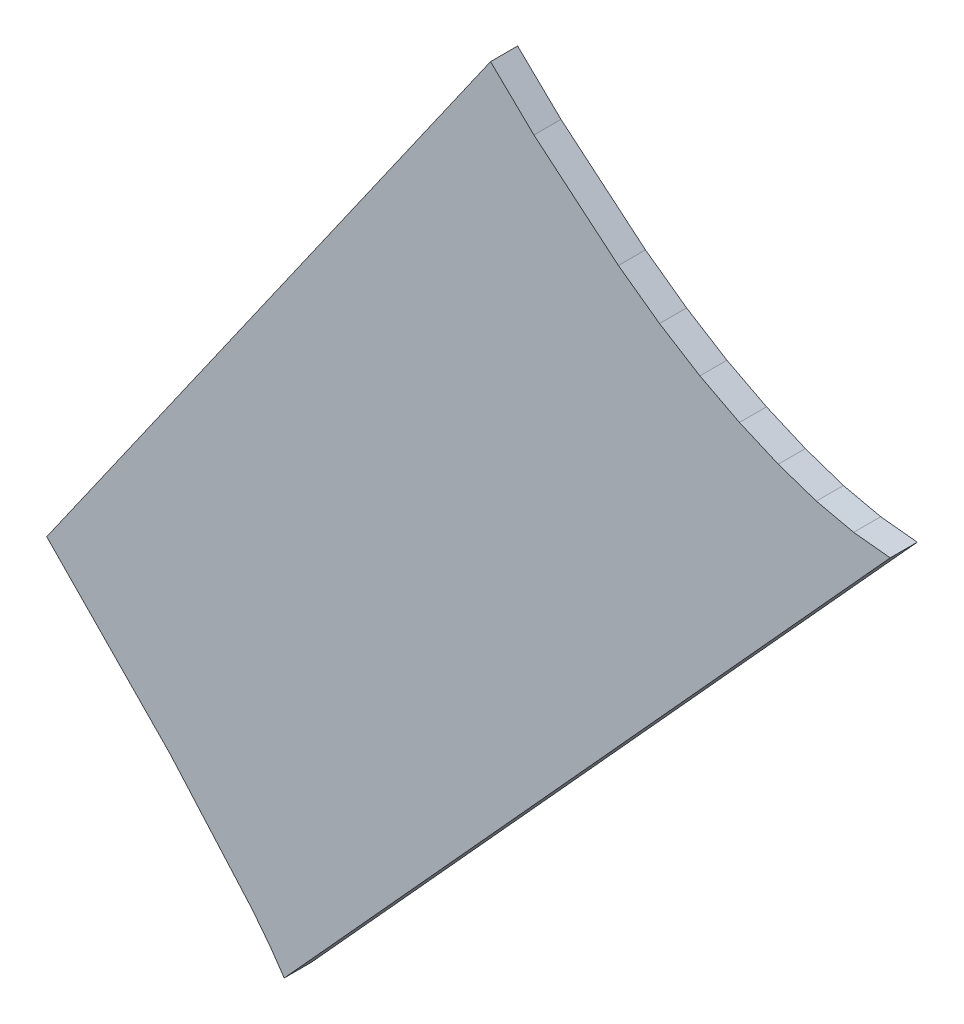
ISO-10303-21;
HEADER;
FILE_DESCRIPTION(('STEP AP214'),'2;1');
FILE_NAME('part.step','',(''),(''),'','','');
FILE_SCHEMA(('AUTOMOTIVE_DESIGN { 1 0 10303 214 1 1 1 1 }'));
ENDSEC;
DATA;
#1=APPLICATION_CONTEXT('core data for automotive mechanical design processes');
#2=APPLICATION_PROTOCOL_DEFINITION('international standard','automotive_design',2000,#1);
#3=PRODUCT_CONTEXT('',#1,'mechanical');
#4=PRODUCT('Part','Part','',(#3));
#5=PRODUCT_RELATED_PRODUCT_CATEGORY('part','',(#4));
#6=PRODUCT_DEFINITION_FORMATION('','',#4);
#7=PRODUCT_DEFINITION_CONTEXT('part definition',#1,'design');
#8=PRODUCT_DEFINITION('design','',#6,#7);
#9=PRODUCT_DEFINITION_SHAPE('','',#8);
#10=(LENGTH_UNIT() NAMED_UNIT(*) SI_UNIT(.MILLI.,.METRE.));
#11=(NAMED_UNIT(*) PLANE_ANGLE_UNIT() SI_UNIT($,.RADIAN.));
#12=(NAMED_UNIT(*) SI_UNIT($,.STERADIAN.) SOLID_ANGLE_UNIT());
#13=UNCERTAINTY_MEASURE_WITH_UNIT(LENGTH_MEASURE(1.E-05),#10,'distance_accuracy_value','');
#14=(GEOMETRIC_REPRESENTATION_CONTEXT(3) GLOBAL_UNCERTAINTY_ASSIGNED_CONTEXT((#13)) GLOBAL_UNIT_ASSIGNED_CONTEXT((#10,
#11,#12)) REPRESENTATION_CONTEXT('',''));
#15=CARTESIAN_POINT('',(0.,0.,0.));
#16=DIRECTION('',(0.,0.,1.));
#17=DIRECTION('',(1.,0.,0.));
#18=AXIS2_PLACEMENT_3D('',#15,#16,#17);
#19=CARTESIAN_POINT('',(67.8379974365234,41.2589988708496,0.));
#20=DIRECTION('',(0.715672064383456,0.698436465443437,0.));
#21=DIRECTION('',(0.698436465443437,-0.715672064383456,0.));
#22=AXIS2_PLACEMENT_3D('',#19,#20,#21);
#23=PLANE('',#22);
#24=DIRECTION('',(0.698436465443437,-0.715672064383456,0.));
#25=VECTOR('',#24,1.);
#26=CARTESIAN_POINT('',(67.8379974365234,41.2589988708496,0.03556));
#27=LINE('',#26,#25);
#28=CARTESIAN_POINT('',(67.8379974365234,41.2589988708496,0.03556));
#29=VERTEX_POINT('',#28);
#30=CARTESIAN_POINT('',(68.,41.0929985046387,0.03556));
#31=VERTEX_POINT('',#30);
#32=EDGE_CURVE('E11',#29,#31,#27,.T.);
#33=ORIENTED_EDGE('',*,*,#32,.F.);
#34=DIRECTION('',(0.,0.,1.));
#35=VECTOR('',#34,1.);
#36=CARTESIAN_POINT('',(67.8379974365234,41.2589988708496,0.));
#37=LINE('',#36,#35);
#38=CARTESIAN_POINT('',(67.8379974365234,41.2589988708496,0.));
#39=VERTEX_POINT('',#38);
#40=EDGE_CURVE('E24',#39,#29,#37,.T.);
#41=ORIENTED_EDGE('',*,*,#40,.F.);
#42=DIRECTION('',(0.698436465443437,-0.715672064383456,0.));
#43=VECTOR('',#42,1.);
#44=CARTESIAN_POINT('',(67.8379974365234,41.2589988708496,0.));
#45=LINE('',#44,#43);
#46=CARTESIAN_POINT('',(68.,41.0929985046387,0.));
#47=VERTEX_POINT('',#46);
#48=EDGE_CURVE('E142',#39,#47,#45,.T.);
#49=ORIENTED_EDGE('',*,*,#48,.T.);
#50=DIRECTION('',(0.,0.,1.));
#51=VECTOR('',#50,1.);
#52=CARTESIAN_POINT('',(68.,41.0929985046387,0.));
#53=LINE('',#52,#51);
#54=EDGE_CURVE('E37',#47,#31,#53,.T.);
#55=ORIENTED_EDGE('',*,*,#54,.T.);
#56=EDGE_LOOP('',(#33,#41,#49,#55));
#57=FACE_BOUND('',#56,.T.);
#58=ADVANCED_FACE('F17',(#57),#23,.F.);
#59=CARTESIAN_POINT('',(68.,41.0929985046387,0.));
#60=DIRECTION('',(0.751427824732606,0.65981529553173,0.));
#61=DIRECTION('',(0.65981529553173,-0.751427824732606,0.));
#62=AXIS2_PLACEMENT_3D('',#59,#60,#61);
#63=PLANE('',#62);
#64=DIRECTION('',(0.65981529553173,-0.751427824732606,0.));
#65=VECTOR('',#64,1.);
#66=CARTESIAN_POINT('',(68.,41.0929985046387,0.03556));
#67=LINE('',#66,#65);
#68=CARTESIAN_POINT('',(68.1080017089844,40.9700012207031,0.03556));
#69=VERTEX_POINT('',#68);
#70=EDGE_CURVE('E238',#31,#69,#67,.T.);
#71=ORIENTED_EDGE('',*,*,#70,.F.);
#72=ORIENTED_EDGE('',*,*,#54,.F.);
#73=DIRECTION('',(0.65981529553173,-0.751427824732606,0.));
#74=VECTOR('',#73,1.);
#75=CARTESIAN_POINT('',(68.,41.0929985046387,0.));
#76=LINE('',#75,#74);
#77=CARTESIAN_POINT('',(68.1080017089844,40.9700012207031,0.));
#78=VERTEX_POINT('',#77);
#79=EDGE_CURVE('E235',#47,#78,#76,.T.);
#80=ORIENTED_EDGE('',*,*,#79,.T.);
#81=DIRECTION('',(0.,0.,1.));
#82=VECTOR('',#81,1.);
#83=CARTESIAN_POINT('',(68.1080017089844,40.9700012207031,0.));
#84=LINE('',#83,#82);
#85=EDGE_CURVE('E233',#78,#69,#84,.T.);
#86=ORIENTED_EDGE('',*,*,#85,.T.);
#87=EDGE_LOOP('',(#71,#72,#80,#86));
#88=FACE_BOUND('',#87,.T.);
#89=ADVANCED_FACE('F246',(#88),#63,.F.);
#90=CARTESIAN_POINT('',(68.1080017089844,40.9700012207031,0.));
#91=DIRECTION('',(0.790717630584863,0.612181042406787,0.));
#92=DIRECTION('',(0.612181042406787,-0.790717630584863,0.));
#93=AXIS2_PLACEMENT_3D('',#90,#91,#92);
#94=PLANE('',#93);
#95=DIRECTION('',(0.612181042406787,-0.790717630584863,0.));
#96=VECTOR('',#95,1.);
#97=CARTESIAN_POINT('',(68.1080017089844,40.9700012207031,0.03556));
#98=LINE('',#97,#96);
#99=CARTESIAN_POINT('',(68.1320037841797,40.9389991760254,0.03556));
#100=VERTEX_POINT('',#99);
#101=EDGE_CURVE('E230',#69,#100,#98,.T.);
#102=ORIENTED_EDGE('',*,*,#101,.F.);
#103=ORIENTED_EDGE('',*,*,#85,.F.);
#104=DIRECTION('',(0.612181042406787,-0.790717630584863,0.));
#105=VECTOR('',#104,1.);
#106=CARTESIAN_POINT('',(68.1080017089844,40.9700012207031,0.));
#107=LINE('',#106,#105);
#108=CARTESIAN_POINT('',(68.1320037841797,40.9389991760254,0.));
#109=VERTEX_POINT('',#108);
#110=EDGE_CURVE('E227',#78,#109,#107,.T.);
#111=ORIENTED_EDGE('',*,*,#110,.T.);
#112=DIRECTION('',(0.,0.,1.));
#113=VECTOR('',#112,1.);
#114=CARTESIAN_POINT('',(68.1320037841797,40.9389991760254,0.));
#115=LINE('',#114,#113);
#116=EDGE_CURVE('E225',#109,#100,#115,.T.);
#117=ORIENTED_EDGE('',*,*,#116,.T.);
#118=EDGE_LOOP('',(#102,#103,#111,#117));
#119=FACE_BOUND('',#118,.T.);
#120=ADVANCED_FACE('F252',(#119),#94,.F.);
#121=CARTESIAN_POINT('',(68.1320037841797,40.9389991760254,0.));
#122=DIRECTION('',(0.822235617188339,0.569147247930543,0.));
#123=DIRECTION('',(0.569147247930543,-0.822235617188339,0.));
#124=AXIS2_PLACEMENT_3D('',#121,#122,#123);
#125=PLANE('',#124);
#126=DIRECTION('',(0.569147247930543,-0.822235617188339,0.));
#127=VECTOR('',#126,1.);
#128=CARTESIAN_POINT('',(68.1320037841797,40.9389991760254,0.03556));
#129=LINE('',#128,#127);
#130=CARTESIAN_POINT('',(68.1500015258789,40.9129981994629,0.03556));
#131=VERTEX_POINT('',#130);
#132=EDGE_CURVE('E222',#100,#131,#129,.T.);
#133=ORIENTED_EDGE('',*,*,#132,.F.);
#134=ORIENTED_EDGE('',*,*,#116,.F.);
#135=DIRECTION('',(0.569147247930543,-0.822235617188339,0.));
#136=VECTOR('',#135,1.);
#137=CARTESIAN_POINT('',(68.1320037841797,40.9389991760254,0.));
#138=LINE('',#137,#136);
#139=CARTESIAN_POINT('',(68.1500015258789,40.9129981994629,0.));
#140=VERTEX_POINT('',#139);
#141=EDGE_CURVE('E219',#109,#140,#138,.T.);
#142=ORIENTED_EDGE('',*,*,#141,.T.);
#143=DIRECTION('',(0.,0.,1.));
#144=VECTOR('',#143,1.);
#145=CARTESIAN_POINT('',(68.1500015258789,40.9129981994629,0.));
#146=LINE('',#145,#144);
#147=EDGE_CURVE('E217',#140,#131,#146,.T.);
#148=ORIENTED_EDGE('',*,*,#147,.T.);
#149=EDGE_LOOP('',(#133,#134,#142,#148));
#150=FACE_BOUND('',#149,.T.);
#151=ADVANCED_FACE('F254',(#150),#125,.F.);
#152=CARTESIAN_POINT('',(68.1500015258789,40.9129981994629,0.));
#153=DIRECTION('',(-0.740095217831593,0.672502095567596,0.));
#154=DIRECTION('',(0.672502095567596,0.740095217831593,0.));
#155=AXIS2_PLACEMENT_3D('',#152,#153,#154);
#156=PLANE('',#155);
#157=DIRECTION('',(0.672502095567596,0.740095217831593,0.));
#158=VECTOR('',#157,1.);
#159=CARTESIAN_POINT('',(68.1500015258789,40.9129981994629,0.03556));
#160=LINE('',#159,#158);
#161=CARTESIAN_POINT('',(68.9459991455078,41.7890014648437,0.03556));
#162=VERTEX_POINT('',#161);
#163=EDGE_CURVE('E214',#131,#162,#160,.T.);
#164=ORIENTED_EDGE('',*,*,#163,.F.);
#165=ORIENTED_EDGE('',*,*,#147,.F.);
#166=DIRECTION('',(0.672502095567596,0.740095217831593,0.));
#167=VECTOR('',#166,1.);
#168=CARTESIAN_POINT('',(68.1500015258789,40.9129981994629,0.));
#169=LINE('',#168,#167);
#170=CARTESIAN_POINT('',(68.9459991455078,41.7890014648437,0.));
#171=VERTEX_POINT('',#170);
#172=EDGE_CURVE('E211',#140,#171,#169,.T.);
#173=ORIENTED_EDGE('',*,*,#172,.T.);
#174=DIRECTION('',(0.,0.,1.));
#175=VECTOR('',#174,1.);
#176=CARTESIAN_POINT('',(68.9459991455078,41.7890014648437,0.));
#177=LINE('',#176,#175);
#178=EDGE_CURVE('E209',#171,#162,#177,.T.);
#179=ORIENTED_EDGE('',*,*,#178,.T.);
#180=EDGE_LOOP('',(#164,#165,#173,#179));
#181=FACE_BOUND('',#180,.T.);
#182=ADVANCED_FACE('F259',(#181),#156,.F.);
#183=CARTESIAN_POINT('',(68.9459991455078,41.7890014648437,0.));
#184=DIRECTION('',(-0.103557207416088,-0.994623499014668,0.));
#185=DIRECTION('',(-0.994623499014668,0.103557207416088,0.));
#186=AXIS2_PLACEMENT_3D('',#183,#184,#185);
#187=PLANE('',#186);
#188=DIRECTION('',(-0.994623499014668,0.103557207416088,0.));
#189=VECTOR('',#188,1.);
#190=CARTESIAN_POINT('',(68.9459991455078,41.7890014648437,0.03556));
#191=LINE('',#190,#189);
#192=CARTESIAN_POINT('',(68.8980026245117,41.7939987182617,0.03556));
#193=VERTEX_POINT('',#192);
#194=EDGE_CURVE('E206',#162,#193,#191,.T.);
#195=ORIENTED_EDGE('',*,*,#194,.F.);
#196=ORIENTED_EDGE('',*,*,#178,.F.);
#197=DIRECTION('',(-0.994623499014668,0.103557207416088,0.));
#198=VECTOR('',#197,1.);
#199=CARTESIAN_POINT('',(68.9459991455078,41.7890014648437,0.));
#200=LINE('',#199,#198);
#201=CARTESIAN_POINT('',(68.8980026245117,41.7939987182617,0.));
#202=VERTEX_POINT('',#201);
#203=EDGE_CURVE('E203',#171,#202,#200,.T.);
#204=ORIENTED_EDGE('',*,*,#203,.T.);
#205=DIRECTION('',(0.,0.,1.));
#206=VECTOR('',#205,1.);
#207=CARTESIAN_POINT('',(68.8980026245117,41.7939987182617,0.));
#208=LINE('',#207,#206);
#209=EDGE_CURVE('E201',#202,#193,#208,.T.);
#210=ORIENTED_EDGE('',*,*,#209,.T.);
#211=EDGE_LOOP('',(#195,#196,#204,#210));
#212=FACE_BOUND('',#211,.T.);
#213=ADVANCED_FACE('F262',(#212),#187,.F.);
#214=CARTESIAN_POINT('',(68.8980026245117,41.7939987182617,0.));
#215=DIRECTION('',(-0.219053099521805,-0.975712939132146,0.));
#216=DIRECTION('',(-0.975712939132146,0.219053099521805,0.));
#217=AXIS2_PLACEMENT_3D('',#214,#215,#216);
#218=PLANE('',#217);
#219=DIRECTION('',(-0.975712939132146,0.219053099521805,0.));
#220=VECTOR('',#219,1.);
#221=CARTESIAN_POINT('',(68.8980026245117,41.7939987182617,0.03556));
#222=LINE('',#221,#220);
#223=CARTESIAN_POINT('',(68.8489990234375,41.8050003051758,0.03556));
#224=VERTEX_POINT('',#223);
#225=EDGE_CURVE('E198',#193,#224,#222,.T.);
#226=ORIENTED_EDGE('',*,*,#225,.F.);
#227=ORIENTED_EDGE('',*,*,#209,.F.);
#228=DIRECTION('',(-0.975712939132146,0.219053099521805,0.));
#229=VECTOR('',#228,1.);
#230=CARTESIAN_POINT('',(68.8980026245117,41.7939987182617,0.));
#231=LINE('',#230,#229);
#232=CARTESIAN_POINT('',(68.8489990234375,41.8050003051758,0.));
#233=VERTEX_POINT('',#232);
#234=EDGE_CURVE('E195',#202,#233,#231,.T.);
#235=ORIENTED_EDGE('',*,*,#234,.T.);
#236=DIRECTION('',(0.,0.,1.));
#237=VECTOR('',#236,1.);
#238=CARTESIAN_POINT('',(68.8489990234375,41.8050003051758,0.));
#239=LINE('',#238,#237);
#240=EDGE_CURVE('E193',#233,#224,#239,.T.);
#241=ORIENTED_EDGE('',*,*,#240,.T.);
#242=EDGE_LOOP('',(#226,#227,#235,#241));
#243=FACE_BOUND('',#242,.T.);
#244=ADVANCED_FACE('F267',(#243),#218,.F.);
#245=CARTESIAN_POINT('',(68.8489990234375,41.8050003051758,0.));
#246=DIRECTION('',(-0.321900143072243,-0.946773625472356,0.));
#247=DIRECTION('',(-0.946773625472356,0.321900143072243,0.));
#248=AXIS2_PLACEMENT_3D('',#245,#246,#247);
#249=PLANE('',#248);
#250=DIRECTION('',(-0.946773625472356,0.321900143072243,0.));
#251=VECTOR('',#250,1.);
#252=CARTESIAN_POINT('',(68.8489990234375,41.8050003051758,0.03556));
#253=LINE('',#252,#251);
#254=CARTESIAN_POINT('',(68.7990036010742,41.8219985961914,0.03556));
#255=VERTEX_POINT('',#254);
#256=EDGE_CURVE('E190',#224,#255,#253,.T.);
#257=ORIENTED_EDGE('',*,*,#256,.F.);
#258=ORIENTED_EDGE('',*,*,#240,.F.);
#259=DIRECTION('',(-0.946773625472356,0.321900143072243,0.));
#260=VECTOR('',#259,1.);
#261=CARTESIAN_POINT('',(68.8489990234375,41.8050003051758,0.));
#262=LINE('',#261,#260);
#263=CARTESIAN_POINT('',(68.7990036010742,41.8219985961914,0.));
#264=VERTEX_POINT('',#263);
#265=EDGE_CURVE('E187',#233,#264,#262,.T.);
#266=ORIENTED_EDGE('',*,*,#265,.T.);
#267=DIRECTION('',(0.,0.,1.));
#268=VECTOR('',#267,1.);
#269=CARTESIAN_POINT('',(68.7990036010742,41.8219985961914,0.));
#270=LINE('',#269,#268);
#271=EDGE_CURVE('E185',#264,#255,#270,.T.);
#272=ORIENTED_EDGE('',*,*,#271,.T.);
#273=EDGE_LOOP('',(#257,#258,#266,#272));
#274=FACE_BOUND('',#273,.T.);
#275=ADVANCED_FACE('F270',(#274),#249,.F.);
#276=CARTESIAN_POINT('',(68.7990036010742,41.8219985961914,0.));
#277=DIRECTION('',(-0.39612290026104,-0.918197499391488,0.));
#278=DIRECTION('',(-0.918197499391488,0.39612290026104,0.));
#279=AXIS2_PLACEMENT_3D('',#276,#277,#278);
#280=PLANE('',#279);
#281=DIRECTION('',(-0.918197499391488,0.39612290026104,0.));
#282=VECTOR('',#281,1.);
#283=CARTESIAN_POINT('',(68.7990036010742,41.8219985961914,0.03556));
#284=LINE('',#283,#282);
#285=CARTESIAN_POINT('',(68.7480010986328,41.8440017700195,0.03556));
#286=VERTEX_POINT('',#285);
#287=EDGE_CURVE('E182',#255,#286,#284,.T.);
#288=ORIENTED_EDGE('',*,*,#287,.F.);
#289=ORIENTED_EDGE('',*,*,#271,.F.);
#290=DIRECTION('',(-0.918197499391488,0.39612290026104,0.));
#291=VECTOR('',#290,1.);
#292=CARTESIAN_POINT('',(68.7990036010742,41.8219985961914,0.));
#293=LINE('',#292,#291);
#294=CARTESIAN_POINT('',(68.7480010986328,41.8440017700195,0.));
#295=VERTEX_POINT('',#294);
#296=EDGE_CURVE('E179',#264,#295,#293,.T.);
#297=ORIENTED_EDGE('',*,*,#296,.T.);
#298=DIRECTION('',(0.,0.,1.));
#299=VECTOR('',#298,1.);
#300=CARTESIAN_POINT('',(68.7480010986328,41.8440017700195,0.));
#301=LINE('',#300,#299);
#302=EDGE_CURVE('E177',#295,#286,#301,.T.);
#303=ORIENTED_EDGE('',*,*,#302,.T.);
#304=EDGE_LOOP('',(#288,#289,#297,#303));
#305=FACE_BOUND('',#304,.T.);
#306=ADVANCED_FACE('F275',(#305),#280,.F.);
#307=CARTESIAN_POINT('',(68.7480010986328,41.8440017700195,0.));
#308=DIRECTION('',(-0.460756099470462,-0.887526797793039,0.));
#309=DIRECTION('',(-0.887526797793039,0.460756099470462,0.));
#310=AXIS2_PLACEMENT_3D('',#307,#308,#309);
#311=PLANE('',#310);
#312=DIRECTION('',(-0.887526797793039,0.460756099470462,0.));
#313=VECTOR('',#312,1.);
#314=CARTESIAN_POINT('',(68.7480010986328,41.8440017700195,0.03556));
#315=LINE('',#314,#313);
#316=CARTESIAN_POINT('',(68.6959991455078,41.8709983825684,0.03556));
#317=VERTEX_POINT('',#316);
#318=EDGE_CURVE('E174',#286,#317,#315,.T.);
#319=ORIENTED_EDGE('',*,*,#318,.F.);
#320=ORIENTED_EDGE('',*,*,#302,.F.);
#321=DIRECTION('',(-0.887526797793039,0.460756099470462,0.));
#322=VECTOR('',#321,1.);
#323=CARTESIAN_POINT('',(68.7480010986328,41.8440017700195,0.));
#324=LINE('',#323,#322);
#325=CARTESIAN_POINT('',(68.6959991455078,41.8709983825684,0.));
#326=VERTEX_POINT('',#325);
#327=EDGE_CURVE('E171',#295,#326,#324,.T.);
#328=ORIENTED_EDGE('',*,*,#327,.T.);
#329=DIRECTION('',(0.,0.,1.));
#330=VECTOR('',#329,1.);
#331=CARTESIAN_POINT('',(68.6959991455078,41.8709983825684,0.));
#332=LINE('',#331,#330);
#333=EDGE_CURVE('E169',#326,#317,#332,.T.);
#334=ORIENTED_EDGE('',*,*,#333,.T.);
#335=EDGE_LOOP('',(#319,#320,#328,#334));
#336=FACE_BOUND('',#335,.T.);
#337=ADVANCED_FACE('F278',(#336),#311,.F.);
#338=CARTESIAN_POINT('',(68.6959991455078,41.8709983825684,0.));
#339=DIRECTION('',(-0.528559283477681,-0.848896391704878,0.));
#340=DIRECTION('',(-0.848896391704878,0.528559283477681,0.));
#341=AXIS2_PLACEMENT_3D('',#338,#339,#340);
#342=PLANE('',#341);
#343=DIRECTION('',(-0.848896391704878,0.528559283477681,0.));
#344=VECTOR('',#343,1.);
#345=CARTESIAN_POINT('',(68.6959991455078,41.8709983825684,0.03556));
#346=LINE('',#345,#344);
#347=CARTESIAN_POINT('',(68.6429977416992,41.9039993286133,0.03556));
#348=VERTEX_POINT('',#347);
#349=EDGE_CURVE('E166',#317,#348,#346,.T.);
#350=ORIENTED_EDGE('',*,*,#349,.F.);
#351=ORIENTED_EDGE('',*,*,#333,.F.);
#352=DIRECTION('',(-0.848896391704878,0.528559283477681,0.));
#353=VECTOR('',#352,1.);
#354=CARTESIAN_POINT('',(68.6959991455078,41.8709983825684,0.));
#355=LINE('',#354,#353);
#356=CARTESIAN_POINT('',(68.6429977416992,41.9039993286133,0.));
#357=VERTEX_POINT('',#356);
#358=EDGE_CURVE('E163',#326,#357,#355,.T.);
#359=ORIENTED_EDGE('',*,*,#358,.T.);
#360=DIRECTION('',(0.,0.,1.));
#361=VECTOR('',#360,1.);
#362=CARTESIAN_POINT('',(68.6429977416992,41.9039993286133,0.));
#363=LINE('',#362,#361);
#364=EDGE_CURVE('E161',#357,#348,#363,.T.);
#365=ORIENTED_EDGE('',*,*,#364,.T.);
#366=EDGE_LOOP('',(#350,#351,#359,#365));
#367=FACE_BOUND('',#366,.T.);
#368=ADVANCED_FACE('F283',(#367),#342,.F.);
#369=CARTESIAN_POINT('',(68.6429977416992,41.9039993286133,0.));
#370=DIRECTION('',(-0.585498917366572,-0.810673188012637,0.));
#371=DIRECTION('',(-0.810673188012637,0.585498917366572,0.));
#372=AXIS2_PLACEMENT_3D('',#369,#370,#371);
#373=PLANE('',#372);
#374=DIRECTION('',(-0.810673188012637,0.585498917366572,0.));
#375=VECTOR('',#374,1.);
#376=CARTESIAN_POINT('',(68.6429977416992,41.9039993286133,0.03556));
#377=LINE('',#376,#375);
#378=CARTESIAN_POINT('',(68.588996887207,41.943000793457,0.03556));
#379=VERTEX_POINT('',#378);
#380=EDGE_CURVE('E158',#348,#379,#377,.T.);
#381=ORIENTED_EDGE('',*,*,#380,.F.);
#382=ORIENTED_EDGE('',*,*,#364,.F.);
#383=DIRECTION('',(-0.810673188012637,0.585498917366572,0.));
#384=VECTOR('',#383,1.);
#385=CARTESIAN_POINT('',(68.6429977416992,41.9039993286133,0.));
#386=LINE('',#385,#384);
#387=CARTESIAN_POINT('',(68.588996887207,41.943000793457,0.));
#388=VERTEX_POINT('',#387);
#389=EDGE_CURVE('E155',#357,#388,#386,.T.);
#390=ORIENTED_EDGE('',*,*,#389,.T.);
#391=DIRECTION('',(0.,0.,1.));
#392=VECTOR('',#391,1.);
#393=CARTESIAN_POINT('',(68.588996887207,41.943000793457,0.));
#394=LINE('',#393,#392);
#395=EDGE_CURVE('E153',#388,#379,#394,.T.);
#396=ORIENTED_EDGE('',*,*,#395,.T.);
#397=EDGE_LOOP('',(#381,#382,#390,#396));
#398=FACE_BOUND('',#397,.T.);
#399=ADVANCED_FACE('F286',(#398),#373,.F.);
#400=CARTESIAN_POINT('',(68.588996887207,41.943000793457,0.));
#401=DIRECTION('',(-0.642213587777665,-0.76652573842875,0.));
#402=DIRECTION('',(-0.76652573842875,0.642213587777665,0.));
#403=AXIS2_PLACEMENT_3D('',#400,#401,#402);
#404=PLANE('',#403);
#405=DIRECTION('',(-0.76652573842875,0.642213587777665,0.));
#406=VECTOR('',#405,1.);
#407=CARTESIAN_POINT('',(68.588996887207,41.943000793457,0.03556));
#408=LINE('',#407,#406);
#409=CARTESIAN_POINT('',(68.4779968261719,42.0359992980957,0.03556));
#410=VERTEX_POINT('',#409);
#411=EDGE_CURVE('E150',#379,#410,#408,.T.);
#412=ORIENTED_EDGE('',*,*,#411,.F.);
#413=ORIENTED_EDGE('',*,*,#395,.F.);
#414=DIRECTION('',(-0.76652573842875,0.642213587777665,0.));
#415=VECTOR('',#414,1.);
#416=CARTESIAN_POINT('',(68.588996887207,41.943000793457,0.));
#417=LINE('',#416,#415);
#418=CARTESIAN_POINT('',(68.4779968261719,42.0359992980957,0.));
#419=VERTEX_POINT('',#418);
#420=EDGE_CURVE('E148',#388,#419,#417,.T.);
#421=ORIENTED_EDGE('',*,*,#420,.T.);
#422=DIRECTION('',(0.,0.,1.));
#423=VECTOR('',#422,1.);
#424=CARTESIAN_POINT('',(68.4779968261719,42.0359992980957,0.));
#425=LINE('',#424,#423);
#426=EDGE_CURVE('E133',#419,#410,#425,.T.);
#427=ORIENTED_EDGE('',*,*,#426,.T.);
#428=EDGE_LOOP('',(#412,#413,#421,#427));
#429=FACE_BOUND('',#428,.T.);
#430=ADVANCED_FACE('F289',(#429),#404,.F.);
#431=CARTESIAN_POINT('',(68.4779968261719,42.0359992980957,0.));
#432=DIRECTION('',(-0.694376174478415,-0.719612206898077,0.));
#433=DIRECTION('',(-0.719612206898077,0.694376174478415,0.));
#434=AXIS2_PLACEMENT_3D('',#431,#432,#433);
#435=PLANE('',#434);
#436=DIRECTION('',(-0.719612206898077,0.694376174478415,0.));
#437=VECTOR('',#436,1.);
#438=CARTESIAN_POINT('',(68.4779968261719,42.0359992980957,0.03556));
#439=LINE('',#438,#437);
#440=CARTESIAN_POINT('',(68.4209976196289,42.0909996032715,0.03556));
#441=VERTEX_POINT('',#440);
#442=EDGE_CURVE('E137',#410,#441,#439,.T.);
#443=ORIENTED_EDGE('',*,*,#442,.F.);
#444=ORIENTED_EDGE('',*,*,#426,.F.);
#445=DIRECTION('',(-0.719612206898077,0.694376174478415,0.));
#446=VECTOR('',#445,1.);
#447=CARTESIAN_POINT('',(68.4779968261719,42.0359992980957,0.));
#448=LINE('',#447,#446);
#449=CARTESIAN_POINT('',(68.4209976196289,42.0909996032715,0.));
#450=VERTEX_POINT('',#449);
#451=EDGE_CURVE('E129',#419,#450,#448,.T.);
#452=ORIENTED_EDGE('',*,*,#451,.T.);
#453=DIRECTION('',(0.,0.,1.));
#454=VECTOR('',#453,1.);
#455=CARTESIAN_POINT('',(68.4209976196289,42.0909996032715,0.));
#456=LINE('',#455,#454);
#457=EDGE_CURVE('E119',#450,#441,#456,.T.);
#458=ORIENTED_EDGE('',*,*,#457,.T.);
#459=EDGE_LOOP('',(#443,#444,#452,#458));
#460=FACE_BOUND('',#459,.T.);
#461=ADVANCED_FACE('F132',(#460),#435,.F.);
#462=CARTESIAN_POINT('',(68.4209976196289,42.0909996032715,0.));
#463=DIRECTION('',(0.818954517970229,-0.573858429838013,0.));
#464=DIRECTION('',(-0.573858429838013,-0.818954517970229,0.));
#465=AXIS2_PLACEMENT_3D('',#462,#463,#464);
#466=PLANE('',#465);
#467=DIRECTION('',(-0.573858429838013,-0.818954517970229,0.));
#468=VECTOR('',#467,1.);
#469=CARTESIAN_POINT('',(68.4209976196289,42.0909996032715,0.03556));
#470=LINE('',#469,#468);
#471=EDGE_CURVE('E125',#441,#29,#470,.T.);
#472=ORIENTED_EDGE('',*,*,#471,.F.);
#473=ORIENTED_EDGE('',*,*,#457,.F.);
#474=DIRECTION('',(-0.573858429838013,-0.818954517970229,0.));
#475=VECTOR('',#474,1.);
#476=CARTESIAN_POINT('',(68.4209976196289,42.0909996032715,0.));
#477=LINE('',#476,#475);
#478=EDGE_CURVE('E123',#450,#39,#477,.T.);
#479=ORIENTED_EDGE('',*,*,#478,.T.);
#480=ORIENTED_EDGE('',*,*,#40,.T.);
#481=EDGE_LOOP('',(#472,#473,#479,#480));
#482=FACE_BOUND('',#481,.T.);
#483=ADVANCED_FACE('F121',(#482),#466,.F.);
#484=CARTESIAN_POINT('',(67.8379974365234,41.2589988708496,0.));
#485=DIRECTION('',(0.,0.,1.));
#486=DIRECTION('',(1.,0.,0.));
#487=AXIS2_PLACEMENT_3D('',#484,#485,#486);
#488=PLANE('',#487);
#489=ORIENTED_EDGE('',*,*,#478,.F.);
#490=ORIENTED_EDGE('',*,*,#451,.F.);
#491=ORIENTED_EDGE('',*,*,#420,.F.);
#492=ORIENTED_EDGE('',*,*,#389,.F.);
#493=ORIENTED_EDGE('',*,*,#358,.F.);
#494=ORIENTED_EDGE('',*,*,#327,.F.);
#495=ORIENTED_EDGE('',*,*,#296,.F.);
#496=ORIENTED_EDGE('',*,*,#265,.F.);
#497=ORIENTED_EDGE('',*,*,#234,.F.);
#498=ORIENTED_EDGE('',*,*,#203,.F.);
#499=ORIENTED_EDGE('',*,*,#172,.F.);
#500=ORIENTED_EDGE('',*,*,#141,.F.);
#501=ORIENTED_EDGE('',*,*,#110,.F.);
#502=ORIENTED_EDGE('',*,*,#79,.F.);
#503=ORIENTED_EDGE('',*,*,#48,.F.);
#504=EDGE_LOOP('',(#489,#490,#491,#492,#493,#494,#495,#496,#497,#498,#499,#500,#501,#502,#503));
#505=FACE_BOUND('',#504,.T.);
#506=ADVANCED_FACE('F140',(#505),#488,.F.);
#507=CARTESIAN_POINT('',(67.8379974365234,41.2589988708496,0.03556));
#508=DIRECTION('',(0.,0.,1.));
#509=DIRECTION('',(1.,0.,0.));
#510=AXIS2_PLACEMENT_3D('',#507,#508,#509);
#511=PLANE('',#510);
#512=ORIENTED_EDGE('',*,*,#32,.T.);
#513=ORIENTED_EDGE('',*,*,#70,.T.);
#514=ORIENTED_EDGE('',*,*,#101,.T.);
#515=ORIENTED_EDGE('',*,*,#132,.T.);
#516=ORIENTED_EDGE('',*,*,#163,.T.);
#517=ORIENTED_EDGE('',*,*,#194,.T.);
#518=ORIENTED_EDGE('',*,*,#225,.T.);
#519=ORIENTED_EDGE('',*,*,#256,.T.);
#520=ORIENTED_EDGE('',*,*,#287,.T.);
#521=ORIENTED_EDGE('',*,*,#318,.T.);
#522=ORIENTED_EDGE('',*,*,#349,.T.);
#523=ORIENTED_EDGE('',*,*,#380,.T.);
#524=ORIENTED_EDGE('',*,*,#411,.T.);
#525=ORIENTED_EDGE('',*,*,#442,.T.);
#526=ORIENTED_EDGE('',*,*,#471,.T.);
#527=EDGE_LOOP('',(#512,#513,#514,#515,#516,#517,#518,#519,#520,#521,#522,#523,#524,#525,#526));
#528=FACE_BOUND('',#527,.T.);
#529=ADVANCED_FACE('F249',(#528),#511,.T.);
#530=CLOSED_SHELL('',(#58,#89,#120,#151,#182,#213,#244,#275,#306,#337,#368,#399,#430,#461,#483,
#506,#529));
#531=MANIFOLD_SOLID_BREP('B1',#530);
#532=ADVANCED_BREP_SHAPE_REPRESENTATION('',(#18,#531),#14);
#533=SHAPE_DEFINITION_REPRESENTATION(#9,#532);
ENDSEC;
END-ISO-10303-21;
